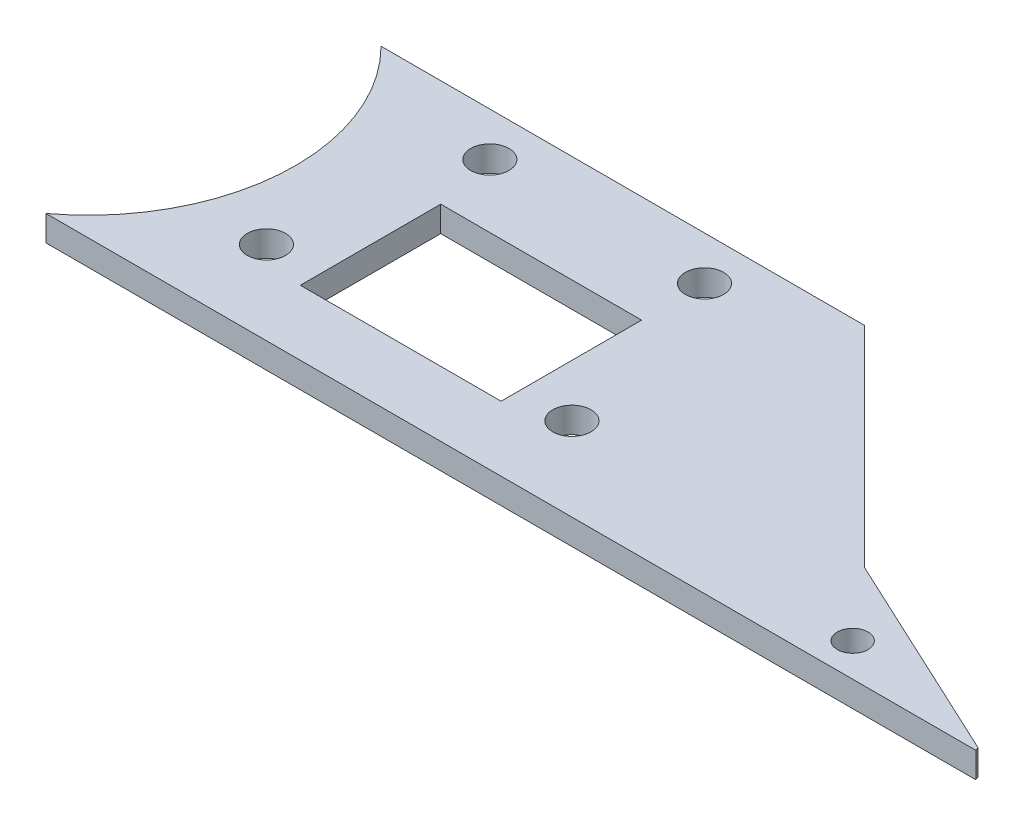
ISO-10303-21;
HEADER;
FILE_DESCRIPTION(('STEP AP214'),'2;1');
FILE_NAME('part.step','',(''),(''),'','','');
FILE_SCHEMA(('AUTOMOTIVE_DESIGN { 1 0 10303 214 1 1 1 1 }'));
ENDSEC;
DATA;
#1=APPLICATION_CONTEXT('core data for automotive mechanical design processes');
#2=APPLICATION_PROTOCOL_DEFINITION('international standard','automotive_design',2000,#1);
#3=PRODUCT_CONTEXT('',#1,'mechanical');
#4=PRODUCT('Part','Part','',(#3));
#5=PRODUCT_RELATED_PRODUCT_CATEGORY('part','',(#4));
#6=PRODUCT_DEFINITION_FORMATION('','',#4);
#7=PRODUCT_DEFINITION_CONTEXT('part definition',#1,'design');
#8=PRODUCT_DEFINITION('design','',#6,#7);
#9=PRODUCT_DEFINITION_SHAPE('','',#8);
#10=(LENGTH_UNIT() NAMED_UNIT(*) SI_UNIT(.MILLI.,.METRE.));
#11=(NAMED_UNIT(*) PLANE_ANGLE_UNIT() SI_UNIT($,.RADIAN.));
#12=(NAMED_UNIT(*) SI_UNIT($,.STERADIAN.) SOLID_ANGLE_UNIT());
#13=UNCERTAINTY_MEASURE_WITH_UNIT(LENGTH_MEASURE(1.E-05),#10,'distance_accuracy_value','');
#14=(GEOMETRIC_REPRESENTATION_CONTEXT(3) GLOBAL_UNCERTAINTY_ASSIGNED_CONTEXT((#13)) GLOBAL_UNIT_ASSIGNED_CONTEXT((#10,
#11,#12)) REPRESENTATION_CONTEXT('',''));
#15=CARTESIAN_POINT('',(0.,0.,0.));
#16=DIRECTION('',(0.,0.,1.));
#17=DIRECTION('',(1.,0.,0.));
#18=AXIS2_PLACEMENT_3D('',#15,#16,#17);
#19=CARTESIAN_POINT('',(-66.6007874639378,2.,10.8319569581962));
#20=DIRECTION('',(0.,1.,0.));
#21=DIRECTION('',(0.,0.,1.));
#22=AXIS2_PLACEMENT_3D('',#19,#20,#21);
#23=PLANE('',#22);
#24=CARTESIAN_POINT('',(3.65105756173379,2.,21.2246917080229));
#25=DIRECTION('',(0.,1.,0.));
#26=DIRECTION('',(0.,0.,1.));
#27=AXIS2_PLACEMENT_3D('',#24,#25,#26);
#28=CIRCLE('',#27,1.2);
#29=CARTESIAN_POINT('',(3.65105756173379,2.,22.4246917080229));
#30=VERTEX_POINT('',#29);
#31=EDGE_CURVE('E118',#30,#30,#28,.T.);
#32=ORIENTED_EDGE('',*,*,#31,.F.);
#33=EDGE_LOOP('',(#32));
#34=FACE_BOUND('',#33,.T.);
#35=CARTESIAN_POINT('',(-46.1933078237589,2.,17.2995690503924));
#36=DIRECTION('',(0.,1.,0.));
#37=DIRECTION('',(0.,0.,1.));
#38=AXIS2_PLACEMENT_3D('',#35,#36,#37);
#39=CIRCLE('',#38,1.5);
#40=CARTESIAN_POINT('',(-46.1933078237589,2.,18.7995690503924));
#41=VERTEX_POINT('',#40);
#42=EDGE_CURVE('E381',#41,#41,#39,.T.);
#43=ORIENTED_EDGE('',*,*,#42,.F.);
#44=EDGE_LOOP('',(#43));
#45=FACE_BOUND('',#44,.T.);
#46=CARTESIAN_POINT('',(-43.205666325321,2.,2.78979940431926));
#47=DIRECTION('',(0.,1.,0.));
#48=DIRECTION('',(0.,0.,1.));
#49=AXIS2_PLACEMENT_3D('',#46,#47,#48);
#50=CIRCLE('',#49,1.5);
#51=CARTESIAN_POINT('',(-43.205666325321,2.,4.28979940431926));
#52=VERTEX_POINT('',#51);
#53=EDGE_CURVE('E352',#52,#52,#50,.T.);
#54=ORIENTED_EDGE('',*,*,#53,.F.);
#55=EDGE_LOOP('',(#54));
#56=FACE_BOUND('',#55,.T.);
#57=DIRECTION('',(-1.,0.,0.));
#58=VECTOR('',#57,1.);
#59=CARTESIAN_POINT('',(-26.3661735280737,2.,7.74257945205895));
#60=LINE('',#59,#58);
#61=CARTESIAN_POINT('',(-26.3661735280737,2.,7.74257945205895));
#62=VERTEX_POINT('',#61);
#63=CARTESIAN_POINT('',(-42.096785232211,2.,7.74257945205895));
#64=VERTEX_POINT('',#63);
#65=EDGE_CURVE('E371',#62,#64,#60,.T.);
#66=ORIENTED_EDGE('',*,*,#65,.F.);
#67=DIRECTION('',(0.,0.,-1.));
#68=VECTOR('',#67,1.);
#69=CARTESIAN_POINT('',(-26.3661735280737,2.,7.74257945205895));
#70=LINE('',#69,#68);
#71=CARTESIAN_POINT('',(-26.3661735280737,2.,18.7425794520587));
#72=VERTEX_POINT('',#71);
#73=EDGE_CURVE('E349',#72,#62,#70,.T.);
#74=ORIENTED_EDGE('',*,*,#73,.F.);
#75=DIRECTION('',(1.,0.,0.));
#76=VECTOR('',#75,1.);
#77=CARTESIAN_POINT('',(-26.3661735280737,2.,18.7425794520587));
#78=LINE('',#77,#76);
#79=CARTESIAN_POINT('',(-42.096785232211,2.,18.7425794520587));
#80=VERTEX_POINT('',#79);
#81=EDGE_CURVE('E358',#80,#72,#78,.T.);
#82=ORIENTED_EDGE('',*,*,#81,.F.);
#83=DIRECTION('',(0.,0.,1.));
#84=VECTOR('',#83,1.);
#85=CARTESIAN_POINT('',(-42.096785232211,2.,7.74257945205895));
#86=LINE('',#85,#84);
#87=EDGE_CURVE('E367',#64,#80,#86,.T.);
#88=ORIENTED_EDGE('',*,*,#87,.F.);
#89=EDGE_LOOP('',(#66,#74,#82,#88));
#90=FACE_BOUND('',#89,.T.);
#91=CARTESIAN_POINT('',(-26.3930466209632,2.,2.78979940431926));
#92=DIRECTION('',(0.,1.,0.));
#93=DIRECTION('',(0.,0.,1.));
#94=AXIS2_PLACEMENT_3D('',#91,#92,#93);
#95=CIRCLE('',#94,1.5);
#96=CARTESIAN_POINT('',(-26.3930466209632,2.,4.28979940431925));
#97=VERTEX_POINT('',#96);
#98=EDGE_CURVE('E376',#97,#97,#95,.T.);
#99=ORIENTED_EDGE('',*,*,#98,.F.);
#100=EDGE_LOOP('',(#99));
#101=FACE_BOUND('',#100,.T.);
#102=CARTESIAN_POINT('',(-22.2661735280737,2.,17.2995690503924));
#103=DIRECTION('',(0.,1.,0.));
#104=DIRECTION('',(0.,0.,1.));
#105=AXIS2_PLACEMENT_3D('',#102,#103,#104);
#106=CIRCLE('',#105,1.5);
#107=CARTESIAN_POINT('',(-22.2661735280737,2.,18.7995690503924));
#108=VERTEX_POINT('',#107);
#109=EDGE_CURVE('E387',#108,#108,#106,.T.);
#110=ORIENTED_EDGE('',*,*,#109,.F.);
#111=EDGE_LOOP('',(#110));
#112=FACE_BOUND('',#111,.T.);
#113=DIRECTION('',(1.,0.,0.));
#114=VECTOR('',#113,1.);
#115=CARTESIAN_POINT('',(-56.923759365185,2.,23.8319569582002));
#116=LINE('',#115,#114);
#117=CARTESIAN_POINT('',(-56.923759365185,2.,23.8319569582002));
#118=VERTEX_POINT('',#117);
#119=CARTESIAN_POINT('',(15.8992125360606,2.,23.8319569582002));
#120=VERTEX_POINT('',#119);
#121=EDGE_CURVE('E139',#118,#120,#116,.T.);
#122=ORIENTED_EDGE('',*,*,#121,.T.);
#123=DIRECTION('',(-0.342020143325671,0.,-0.939692620785908));
#124=VECTOR('',#123,1.);
#125=CARTESIAN_POINT('',(2.07042635175467,2.,-14.162320821646));
#126=LINE('',#125,#124);
#127=CARTESIAN_POINT('',(15.8003386452881,2.,23.5603031759292));
#128=VERTEX_POINT('',#127);
#129=EDGE_CURVE('E50',#120,#128,#126,.T.);
#130=ORIENTED_EDGE('',*,*,#129,.T.);
#131=DIRECTION('',(-0.906307787036571,0.,-0.422618261740869));
#132=VECTOR('',#131,1.);
#133=CARTESIAN_POINT('',(16.3829020613507,2.,23.8319569582002));
#134=LINE('',#133,#132);
#135=CARTESIAN_POINT('',(-0.836945892341522,2.,15.8022099851249));
#136=VERTEX_POINT('',#135);
#137=EDGE_CURVE('E125',#128,#136,#134,.T.);
#138=ORIENTED_EDGE('',*,*,#137,.T.);
#139=DIRECTION('',(-0.707106781186548,0.,-0.707106781186547));
#140=VECTOR('',#139,1.);
#141=CARTESIAN_POINT('',(-0.836945892341522,2.,15.8022099851249));
#142=LINE('',#141,#140);
#143=CARTESIAN_POINT('',(-17.2719747348862,2.,-0.632818857419724));
#144=VERTEX_POINT('',#143);
#145=EDGE_CURVE('E160',#136,#144,#142,.T.);
#146=ORIENTED_EDGE('',*,*,#145,.T.);
#147=DIRECTION('',(-1.,0.,0.));
#148=VECTOR('',#147,1.);
#149=CARTESIAN_POINT('',(-55.1463652470897,2.,-0.632818857419724));
#150=LINE('',#149,#148);
#151=CARTESIAN_POINT('',(-55.1463652470897,2.,-0.632818857419719));
#152=VERTEX_POINT('',#151);
#153=EDGE_CURVE('E163',#144,#152,#150,.T.);
#154=ORIENTED_EDGE('',*,*,#153,.T.);
#155=CARTESIAN_POINT('',(-66.6007874639378,2.,10.8319569581962));
#156=DIRECTION('',(0.,-1.,0.));
#157=DIRECTION('',(0.,0.,1.));
#158=AXIS2_PLACEMENT_3D('',#155,#156,#157);
#159=CIRCLE('',#158,16.2063220017422);
#160=EDGE_CURVE('E165',#152,#118,#159,.T.);
#161=ORIENTED_EDGE('',*,*,#160,.T.);
#162=EDGE_LOOP('',(#122,#130,#138,#146,#154,#161));
#163=FACE_BOUND('',#162,.T.);
#164=ADVANCED_FACE('F36',(#34,#45,#56,#90,#101,#112,#163),#23,.T.);
#165=CARTESIAN_POINT('',(-66.6007874639378,0.,10.8319569581962));
#166=DIRECTION('',(0.,1.,0.));
#167=DIRECTION('',(0.,0.,1.));
#168=AXIS2_PLACEMENT_3D('',#165,#166,#167);
#169=PLANE('',#168);
#170=CARTESIAN_POINT('',(3.65105756173379,0.,21.2246917080229));
#171=DIRECTION('',(0.,-1.,0.));
#172=DIRECTION('',(0.,0.,-1.));
#173=AXIS2_PLACEMENT_3D('',#170,#171,#172);
#174=CIRCLE('',#173,1.2);
#175=CARTESIAN_POINT('',(3.65105756173379,0.,20.0246917080229));
#176=VERTEX_POINT('',#175);
#177=EDGE_CURVE('E398',#176,#176,#174,.T.);
#178=ORIENTED_EDGE('',*,*,#177,.F.);
#179=EDGE_LOOP('',(#178));
#180=FACE_BOUND('',#179,.T.);
#181=CARTESIAN_POINT('',(-22.2661735280737,0.,17.2995690503924));
#182=DIRECTION('',(0.,1.,0.));
#183=DIRECTION('',(0.,0.,1.));
#184=AXIS2_PLACEMENT_3D('',#181,#182,#183);
#185=CIRCLE('',#184,1.5);
#186=CARTESIAN_POINT('',(-22.2661735280737,0.,18.7995690503924));
#187=VERTEX_POINT('',#186);
#188=EDGE_CURVE('E390',#187,#187,#185,.T.);
#189=ORIENTED_EDGE('',*,*,#188,.T.);
#190=EDGE_LOOP('',(#189));
#191=FACE_BOUND('',#190,.T.);
#192=CARTESIAN_POINT('',(-46.1933078237589,0.,17.2995690503924));
#193=DIRECTION('',(0.,1.,0.));
#194=DIRECTION('',(0.,0.,1.));
#195=AXIS2_PLACEMENT_3D('',#192,#193,#194);
#196=CIRCLE('',#195,1.5);
#197=CARTESIAN_POINT('',(-46.1933078237589,0.,18.7995690503924));
#198=VERTEX_POINT('',#197);
#199=EDGE_CURVE('E384',#198,#198,#196,.T.);
#200=ORIENTED_EDGE('',*,*,#199,.T.);
#201=EDGE_LOOP('',(#200));
#202=FACE_BOUND('',#201,.T.);
#203=CARTESIAN_POINT('',(-26.3930466209632,0.,2.78979940431926));
#204=DIRECTION('',(0.,1.,0.));
#205=DIRECTION('',(0.,0.,1.));
#206=AXIS2_PLACEMENT_3D('',#203,#204,#205);
#207=CIRCLE('',#206,1.5);
#208=CARTESIAN_POINT('',(-26.3930466209632,0.,4.28979940431925));
#209=VERTEX_POINT('',#208);
#210=EDGE_CURVE('E378',#209,#209,#207,.T.);
#211=ORIENTED_EDGE('',*,*,#210,.T.);
#212=EDGE_LOOP('',(#211));
#213=FACE_BOUND('',#212,.T.);
#214=CARTESIAN_POINT('',(-43.205666325321,0.,2.78979940431926));
#215=DIRECTION('',(0.,1.,0.));
#216=DIRECTION('',(0.,0.,1.));
#217=AXIS2_PLACEMENT_3D('',#214,#215,#216);
#218=CIRCLE('',#217,1.5);
#219=CARTESIAN_POINT('',(-43.205666325321,0.,4.28979940431926));
#220=VERTEX_POINT('',#219);
#221=EDGE_CURVE('E355',#220,#220,#218,.T.);
#222=ORIENTED_EDGE('',*,*,#221,.T.);
#223=EDGE_LOOP('',(#222));
#224=FACE_BOUND('',#223,.T.);
#225=DIRECTION('',(0.,0.,-1.));
#226=VECTOR('',#225,1.);
#227=CARTESIAN_POINT('',(-26.3661735280737,0.,7.74257945205895));
#228=LINE('',#227,#226);
#229=CARTESIAN_POINT('',(-26.3661735280737,0.,18.7425794520587));
#230=VERTEX_POINT('',#229);
#231=CARTESIAN_POINT('',(-26.3661735280737,0.,7.74257945205895));
#232=VERTEX_POINT('',#231);
#233=EDGE_CURVE('E344',#230,#232,#228,.T.);
#234=ORIENTED_EDGE('',*,*,#233,.T.);
#235=DIRECTION('',(-1.,0.,0.));
#236=VECTOR('',#235,1.);
#237=CARTESIAN_POINT('',(-26.3661735280737,0.,7.74257945205895));
#238=LINE('',#237,#236);
#239=CARTESIAN_POINT('',(-42.096785232211,0.,7.74257945205895));
#240=VERTEX_POINT('',#239);
#241=EDGE_CURVE('E336',#232,#240,#238,.T.);
#242=ORIENTED_EDGE('',*,*,#241,.T.);
#243=DIRECTION('',(0.,0.,1.));
#244=VECTOR('',#243,1.);
#245=CARTESIAN_POINT('',(-42.096785232211,0.,7.74257945205895));
#246=LINE('',#245,#244);
#247=CARTESIAN_POINT('',(-42.096785232211,0.,18.7425794520587));
#248=VERTEX_POINT('',#247);
#249=EDGE_CURVE('E343',#240,#248,#246,.T.);
#250=ORIENTED_EDGE('',*,*,#249,.T.);
#251=DIRECTION('',(1.,0.,0.));
#252=VECTOR('',#251,1.);
#253=CARTESIAN_POINT('',(-26.3661735280737,0.,18.7425794520587));
#254=LINE('',#253,#252);
#255=EDGE_CURVE('E351',#248,#230,#254,.T.);
#256=ORIENTED_EDGE('',*,*,#255,.T.);
#257=EDGE_LOOP('',(#234,#242,#250,#256));
#258=FACE_BOUND('',#257,.T.);
#259=DIRECTION('',(0.342020143325671,0.,0.939692620785908));
#260=VECTOR('',#259,1.);
#261=CARTESIAN_POINT('',(15.8003386452881,0.,23.5603031759292));
#262=LINE('',#261,#260);
#263=CARTESIAN_POINT('',(15.8003386452881,0.,23.5603031759292));
#264=VERTEX_POINT('',#263);
#265=CARTESIAN_POINT('',(15.8992125360606,0.,23.8319569582004));
#266=VERTEX_POINT('',#265);
#267=EDGE_CURVE('E110',#264,#266,#262,.T.);
#268=ORIENTED_EDGE('',*,*,#267,.T.);
#269=DIRECTION('',(1.,0.,0.));
#270=VECTOR('',#269,1.);
#271=CARTESIAN_POINT('',(-56.923759365185,0.,23.8319569582002));
#272=LINE('',#271,#270);
#273=CARTESIAN_POINT('',(-56.923759365185,0.,23.8319569582002));
#274=VERTEX_POINT('',#273);
#275=EDGE_CURVE('E146',#274,#266,#272,.T.);
#276=ORIENTED_EDGE('',*,*,#275,.F.);
#277=CARTESIAN_POINT('',(-66.6007874639378,0.,10.8319569581962));
#278=DIRECTION('',(0.,-1.,0.));
#279=DIRECTION('',(0.,0.,1.));
#280=AXIS2_PLACEMENT_3D('',#277,#278,#279);
#281=CIRCLE('',#280,16.2063220017422);
#282=CARTESIAN_POINT('',(-55.1463652470897,0.,-0.632818857419719));
#283=VERTEX_POINT('',#282);
#284=EDGE_CURVE('E144',#283,#274,#281,.T.);
#285=ORIENTED_EDGE('',*,*,#284,.F.);
#286=DIRECTION('',(-1.,0.,0.));
#287=VECTOR('',#286,1.);
#288=CARTESIAN_POINT('',(-55.1463652470897,0.,-0.632818857419724));
#289=LINE('',#288,#287);
#290=CARTESIAN_POINT('',(-17.2719747348862,0.,-0.632818857419724));
#291=VERTEX_POINT('',#290);
#292=EDGE_CURVE('E133',#291,#283,#289,.T.);
#293=ORIENTED_EDGE('',*,*,#292,.F.);
#294=DIRECTION('',(-0.707106781186548,0.,-0.707106781186547));
#295=VECTOR('',#294,1.);
#296=CARTESIAN_POINT('',(-0.836945892341522,0.,15.8022099851249));
#297=LINE('',#296,#295);
#298=CARTESIAN_POINT('',(-0.836945892341522,0.,15.8022099851249));
#299=VERTEX_POINT('',#298);
#300=EDGE_CURVE('E129',#299,#291,#297,.T.);
#301=ORIENTED_EDGE('',*,*,#300,.F.);
#302=DIRECTION('',(-0.906307787036571,0.,-0.422618261740869));
#303=VECTOR('',#302,1.);
#304=CARTESIAN_POINT('',(16.3829020613507,0.,23.8319569582002));
#305=LINE('',#304,#303);
#306=EDGE_CURVE('E123',#264,#299,#305,.T.);
#307=ORIENTED_EDGE('',*,*,#306,.F.);
#308=EDGE_LOOP('',(#268,#276,#285,#293,#301,#307));
#309=FACE_BOUND('',#308,.T.);
#310=ADVANCED_FACE('F127',(#180,#191,#202,#213,#224,#258,#309),#169,.F.);
#311=CARTESIAN_POINT('',(16.3829020613507,2.,23.8319569582002));
#312=DIRECTION('',(-0.422618261740869,0.,0.906307787036571));
#313=DIRECTION('',(0.906307787036571,0.,0.422618261740869));
#314=AXIS2_PLACEMENT_3D('',#311,#312,#313);
#315=PLANE('',#314);
#316=DIRECTION('',(0.,-1.,0.));
#317=VECTOR('',#316,1.);
#318=CARTESIAN_POINT('',(15.8003386452881,108.5,23.5603031759292));
#319=LINE('',#318,#317);
#320=EDGE_CURVE('E113',#128,#264,#319,.T.);
#321=ORIENTED_EDGE('',*,*,#320,.T.);
#322=ORIENTED_EDGE('',*,*,#306,.T.);
#323=DIRECTION('',(0.,-1.,0.));
#324=VECTOR('',#323,1.);
#325=CARTESIAN_POINT('',(-0.836945892341522,2.,15.8022099851249));
#326=LINE('',#325,#324);
#327=EDGE_CURVE('E44',#136,#299,#326,.T.);
#328=ORIENTED_EDGE('',*,*,#327,.F.);
#329=ORIENTED_EDGE('',*,*,#137,.F.);
#330=EDGE_LOOP('',(#321,#322,#328,#329));
#331=FACE_BOUND('',#330,.T.);
#332=ADVANCED_FACE('F38',(#331),#315,.F.);
#333=CARTESIAN_POINT('',(-56.923759365185,2.,23.8319569582002));
#334=DIRECTION('',(0.,0.,-1.));
#335=DIRECTION('',(-1.,0.,0.));
#336=AXIS2_PLACEMENT_3D('',#333,#334,#335);
#337=PLANE('',#336);
#338=DIRECTION('',(0.,-1.,0.));
#339=VECTOR('',#338,1.);
#340=CARTESIAN_POINT('',(15.8992125360606,2.,23.8319569582002));
#341=LINE('',#340,#339);
#342=EDGE_CURVE('E11',#120,#266,#341,.T.);
#343=ORIENTED_EDGE('',*,*,#342,.F.);
#344=ORIENTED_EDGE('',*,*,#121,.F.);
#345=DIRECTION('',(0.,-1.,0.));
#346=VECTOR('',#345,1.);
#347=CARTESIAN_POINT('',(-56.923759365185,2.,23.8319569582002));
#348=LINE('',#347,#346);
#349=EDGE_CURVE('E148',#118,#274,#348,.T.);
#350=ORIENTED_EDGE('',*,*,#349,.T.);
#351=ORIENTED_EDGE('',*,*,#275,.T.);
#352=EDGE_LOOP('',(#343,#344,#350,#351));
#353=FACE_BOUND('',#352,.T.);
#354=ADVANCED_FACE('F173',(#353),#337,.F.);
#355=CARTESIAN_POINT('',(-0.836945892341522,2.,15.8022099851249));
#356=DIRECTION('',(-0.707106781186547,0.,0.707106781186548));
#357=DIRECTION('',(0.707106781186548,0.,0.707106781186547));
#358=AXIS2_PLACEMENT_3D('',#355,#356,#357);
#359=PLANE('',#358);
#360=ORIENTED_EDGE('',*,*,#300,.T.);
#361=DIRECTION('',(0.,-1.,0.));
#362=VECTOR('',#361,1.);
#363=CARTESIAN_POINT('',(-17.2719747348862,2.,-0.632818857419724));
#364=LINE('',#363,#362);
#365=EDGE_CURVE('E154',#144,#291,#364,.T.);
#366=ORIENTED_EDGE('',*,*,#365,.F.);
#367=ORIENTED_EDGE('',*,*,#145,.F.);
#368=ORIENTED_EDGE('',*,*,#327,.T.);
#369=EDGE_LOOP('',(#360,#366,#367,#368));
#370=FACE_BOUND('',#369,.T.);
#371=ADVANCED_FACE('F158',(#370),#359,.F.);
#372=CARTESIAN_POINT('',(-55.1463652470897,2.,-0.632818857419724));
#373=DIRECTION('',(0.,0.,1.));
#374=DIRECTION('',(1.,0.,0.));
#375=AXIS2_PLACEMENT_3D('',#372,#373,#374);
#376=PLANE('',#375);
#377=ORIENTED_EDGE('',*,*,#292,.T.);
#378=DIRECTION('',(0.,-1.,0.));
#379=VECTOR('',#378,1.);
#380=CARTESIAN_POINT('',(-55.1463652470897,2.,-0.632818857419719));
#381=LINE('',#380,#379);
#382=EDGE_CURVE('E151',#152,#283,#381,.T.);
#383=ORIENTED_EDGE('',*,*,#382,.F.);
#384=ORIENTED_EDGE('',*,*,#153,.F.);
#385=ORIENTED_EDGE('',*,*,#365,.T.);
#386=EDGE_LOOP('',(#377,#383,#384,#385));
#387=FACE_BOUND('',#386,.T.);
#388=ADVANCED_FACE('F177',(#387),#376,.F.);
#389=CARTESIAN_POINT('',(-66.6007874639378,2.,10.8319569581962));
#390=DIRECTION('',(0.,-1.,0.));
#391=DIRECTION('',(0.,0.,-1.));
#392=AXIS2_PLACEMENT_3D('',#389,#390,#391);
#393=CYLINDRICAL_SURFACE('',#392,16.2063220017422);
#394=ORIENTED_EDGE('',*,*,#284,.T.);
#395=ORIENTED_EDGE('',*,*,#349,.F.);
#396=ORIENTED_EDGE('',*,*,#160,.F.);
#397=ORIENTED_EDGE('',*,*,#382,.T.);
#398=EDGE_LOOP('',(#394,#395,#396,#397));
#399=FACE_BOUND('',#398,.T.);
#400=ADVANCED_FACE('F178',(#399),#393,.F.);
#401=CARTESIAN_POINT('',(-26.3661735280737,2.,7.74257945205895));
#402=DIRECTION('',(-1.,0.,0.));
#403=DIRECTION('',(0.,0.,1.));
#404=AXIS2_PLACEMENT_3D('',#401,#402,#403);
#405=PLANE('',#404);
#406=ORIENTED_EDGE('',*,*,#233,.F.);
#407=DIRECTION('',(0.,-1.,0.));
#408=VECTOR('',#407,1.);
#409=CARTESIAN_POINT('',(-26.3661735280737,2.,18.7425794520587));
#410=LINE('',#409,#408);
#411=EDGE_CURVE('E363',#72,#230,#410,.T.);
#412=ORIENTED_EDGE('',*,*,#411,.F.);
#413=ORIENTED_EDGE('',*,*,#73,.T.);
#414=DIRECTION('',(0.,-1.,0.));
#415=VECTOR('',#414,1.);
#416=CARTESIAN_POINT('',(-26.3661735280737,2.,7.74257945205895));
#417=LINE('',#416,#415);
#418=EDGE_CURVE('E131',#62,#232,#417,.T.);
#419=ORIENTED_EDGE('',*,*,#418,.T.);
#420=EDGE_LOOP('',(#406,#412,#413,#419));
#421=FACE_BOUND('',#420,.T.);
#422=ADVANCED_FACE('F180',(#421),#405,.T.);
#423=CARTESIAN_POINT('',(-26.3661735280737,2.,7.74257945205895));
#424=DIRECTION('',(0.,0.,1.));
#425=DIRECTION('',(1.,0.,0.));
#426=AXIS2_PLACEMENT_3D('',#423,#424,#425);
#427=PLANE('',#426);
#428=ORIENTED_EDGE('',*,*,#241,.F.);
#429=ORIENTED_EDGE('',*,*,#418,.F.);
#430=ORIENTED_EDGE('',*,*,#65,.T.);
#431=DIRECTION('',(0.,-1.,0.));
#432=VECTOR('',#431,1.);
#433=CARTESIAN_POINT('',(-42.096785232211,2.,7.74257945205895));
#434=LINE('',#433,#432);
#435=EDGE_CURVE('E136',#64,#240,#434,.T.);
#436=ORIENTED_EDGE('',*,*,#435,.T.);
#437=EDGE_LOOP('',(#428,#429,#430,#436));
#438=FACE_BOUND('',#437,.T.);
#439=ADVANCED_FACE('F186',(#438),#427,.T.);
#440=CARTESIAN_POINT('',(-42.096785232211,2.,7.74257945205895));
#441=DIRECTION('',(1.,0.,0.));
#442=DIRECTION('',(0.,0.,-1.));
#443=AXIS2_PLACEMENT_3D('',#440,#441,#442);
#444=PLANE('',#443);
#445=ORIENTED_EDGE('',*,*,#249,.F.);
#446=ORIENTED_EDGE('',*,*,#435,.F.);
#447=ORIENTED_EDGE('',*,*,#87,.T.);
#448=DIRECTION('',(0.,-1.,0.));
#449=VECTOR('',#448,1.);
#450=CARTESIAN_POINT('',(-42.096785232211,2.,18.7425794520587));
#451=LINE('',#450,#449);
#452=EDGE_CURVE('E58',#80,#248,#451,.T.);
#453=ORIENTED_EDGE('',*,*,#452,.T.);
#454=EDGE_LOOP('',(#445,#446,#447,#453));
#455=FACE_BOUND('',#454,.T.);
#456=ADVANCED_FACE('F273',(#455),#444,.T.);
#457=CARTESIAN_POINT('',(-26.3661735280737,2.,18.7425794520587));
#458=DIRECTION('',(0.,0.,-1.));
#459=DIRECTION('',(-1.,0.,0.));
#460=AXIS2_PLACEMENT_3D('',#457,#458,#459);
#461=PLANE('',#460);
#462=ORIENTED_EDGE('',*,*,#255,.F.);
#463=ORIENTED_EDGE('',*,*,#452,.F.);
#464=ORIENTED_EDGE('',*,*,#81,.T.);
#465=ORIENTED_EDGE('',*,*,#411,.T.);
#466=EDGE_LOOP('',(#462,#463,#464,#465));
#467=FACE_BOUND('',#466,.T.);
#468=ADVANCED_FACE('F265',(#467),#461,.T.);
#469=CARTESIAN_POINT('',(-43.205666325321,2.,2.78979940431926));
#470=DIRECTION('',(0.,-1.,0.));
#471=DIRECTION('',(0.,0.,-1.));
#472=AXIS2_PLACEMENT_3D('',#469,#470,#471);
#473=CYLINDRICAL_SURFACE('',#472,1.5);
#474=ORIENTED_EDGE('',*,*,#53,.T.);
#475=EDGE_LOOP('',(#474));
#476=FACE_BOUND('',#475,.T.);
#477=ORIENTED_EDGE('',*,*,#221,.F.);
#478=EDGE_LOOP('',(#477));
#479=FACE_BOUND('',#478,.T.);
#480=ADVANCED_FACE('F257',(#476,#479),#473,.F.);
#481=CARTESIAN_POINT('',(-26.3930466209632,2.,2.78979940431926));
#482=DIRECTION('',(0.,-1.,0.));
#483=DIRECTION('',(0.,0.,-1.));
#484=AXIS2_PLACEMENT_3D('',#481,#482,#483);
#485=CYLINDRICAL_SURFACE('',#484,1.5);
#486=ORIENTED_EDGE('',*,*,#98,.T.);
#487=EDGE_LOOP('',(#486));
#488=FACE_BOUND('',#487,.T.);
#489=ORIENTED_EDGE('',*,*,#210,.F.);
#490=EDGE_LOOP('',(#489));
#491=FACE_BOUND('',#490,.T.);
#492=ADVANCED_FACE('F249',(#488,#491),#485,.F.);
#493=CARTESIAN_POINT('',(-46.1933078237589,2.,17.2995690503924));
#494=DIRECTION('',(0.,-1.,0.));
#495=DIRECTION('',(0.,0.,-1.));
#496=AXIS2_PLACEMENT_3D('',#493,#494,#495);
#497=CYLINDRICAL_SURFACE('',#496,1.5);
#498=ORIENTED_EDGE('',*,*,#42,.T.);
#499=EDGE_LOOP('',(#498));
#500=FACE_BOUND('',#499,.T.);
#501=ORIENTED_EDGE('',*,*,#199,.F.);
#502=EDGE_LOOP('',(#501));
#503=FACE_BOUND('',#502,.T.);
#504=ADVANCED_FACE('F241',(#500,#503),#497,.F.);
#505=CARTESIAN_POINT('',(-22.2661735280737,2.,17.2995690503924));
#506=DIRECTION('',(0.,-1.,0.));
#507=DIRECTION('',(0.,0.,-1.));
#508=AXIS2_PLACEMENT_3D('',#505,#506,#507);
#509=CYLINDRICAL_SURFACE('',#508,1.5);
#510=ORIENTED_EDGE('',*,*,#109,.T.);
#511=EDGE_LOOP('',(#510));
#512=FACE_BOUND('',#511,.T.);
#513=ORIENTED_EDGE('',*,*,#188,.F.);
#514=EDGE_LOOP('',(#513));
#515=FACE_BOUND('',#514,.T.);
#516=ADVANCED_FACE('F236',(#512,#515),#509,.F.);
#517=CARTESIAN_POINT('',(15.8003386452881,108.5,23.5603031759292));
#518=DIRECTION('',(0.939692620785907,0.,-0.342020143325671));
#519=DIRECTION('',(-0.342020143325671,0.,-0.939692620785908));
#520=AXIS2_PLACEMENT_3D('',#517,#518,#519);
#521=PLANE('',#520);
#522=ORIENTED_EDGE('',*,*,#342,.T.);
#523=ORIENTED_EDGE('',*,*,#267,.F.);
#524=ORIENTED_EDGE('',*,*,#320,.F.);
#525=ORIENTED_EDGE('',*,*,#129,.F.);
#526=EDGE_LOOP('',(#522,#523,#524,#525));
#527=FACE_BOUND('',#526,.T.);
#528=ADVANCED_FACE('F112',(#527),#521,.T.);
#529=CARTESIAN_POINT('',(3.65105756173379,15.,21.2246917080229));
#530=DIRECTION('',(0.,-1.,0.));
#531=DIRECTION('',(0.,0.,-1.));
#532=AXIS2_PLACEMENT_3D('',#529,#530,#531);
#533=CYLINDRICAL_SURFACE('',#532,1.2);
#534=ORIENTED_EDGE('',*,*,#31,.T.);
#535=EDGE_LOOP('',(#534));
#536=FACE_BOUND('',#535,.T.);
#537=ORIENTED_EDGE('',*,*,#177,.T.);
#538=EDGE_LOOP('',(#537));
#539=FACE_BOUND('',#538,.T.);
#540=ADVANCED_FACE('F223',(#536,#539),#533,.F.);
#541=CLOSED_SHELL('',(#164,#310,#332,#354,#371,#388,#400,#422,#439,#456,#468,#480,#492,#504,
#516,#528,#540));
#542=MANIFOLD_SOLID_BREP('B2',#541);
#543=ADVANCED_BREP_SHAPE_REPRESENTATION('',(#18,#542),#14);
#544=SHAPE_DEFINITION_REPRESENTATION(#9,#543);
ENDSEC;
END-ISO-10303-21;
